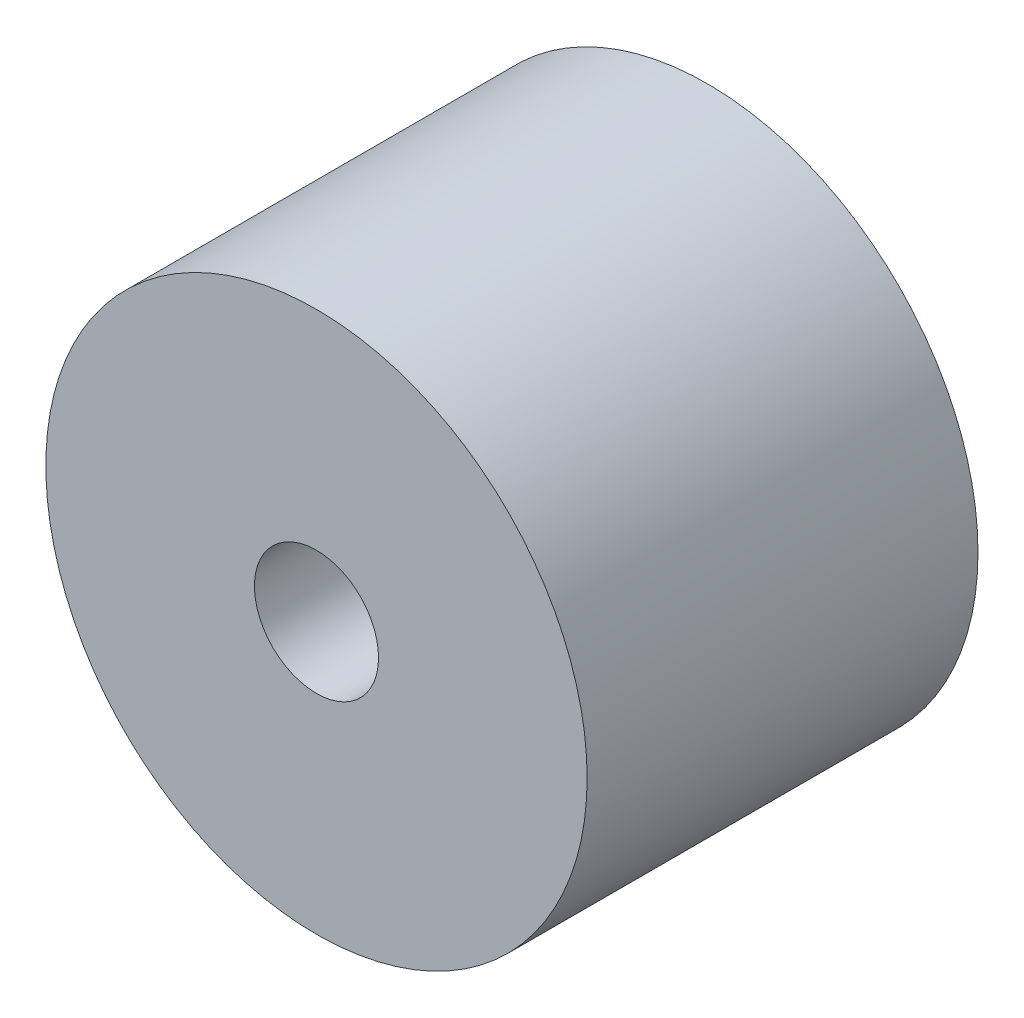
ISO-10303-21;
HEADER;
FILE_DESCRIPTION(('STEP AP214'),'2;1');
FILE_NAME('part.step','',(''),(''),'','','');
FILE_SCHEMA(('AUTOMOTIVE_DESIGN { 1 0 10303 214 1 1 1 1 }'));
ENDSEC;
DATA;
#1=APPLICATION_CONTEXT('core data for automotive mechanical design processes');
#2=APPLICATION_PROTOCOL_DEFINITION('international standard','automotive_design',2000,#1);
#3=PRODUCT_CONTEXT('',#1,'mechanical');
#4=PRODUCT('Part','Part','',(#3));
#5=PRODUCT_RELATED_PRODUCT_CATEGORY('part','',(#4));
#6=PRODUCT_DEFINITION_FORMATION('','',#4);
#7=PRODUCT_DEFINITION_CONTEXT('part definition',#1,'design');
#8=PRODUCT_DEFINITION('design','',#6,#7);
#9=PRODUCT_DEFINITION_SHAPE('','',#8);
#10=(LENGTH_UNIT() NAMED_UNIT(*) SI_UNIT(.MILLI.,.METRE.));
#11=(NAMED_UNIT(*) PLANE_ANGLE_UNIT() SI_UNIT($,.RADIAN.));
#12=(NAMED_UNIT(*) SI_UNIT($,.STERADIAN.) SOLID_ANGLE_UNIT());
#13=UNCERTAINTY_MEASURE_WITH_UNIT(LENGTH_MEASURE(1.E-05),#10,'distance_accuracy_value','');
#14=(GEOMETRIC_REPRESENTATION_CONTEXT(3) GLOBAL_UNCERTAINTY_ASSIGNED_CONTEXT((#13)) GLOBAL_UNIT_ASSIGNED_CONTEXT((#10,
#11,#12)) REPRESENTATION_CONTEXT('',''));
#15=CARTESIAN_POINT('',(0.,0.,0.));
#16=DIRECTION('',(0.,0.,1.));
#17=DIRECTION('',(1.,0.,0.));
#18=AXIS2_PLACEMENT_3D('',#15,#16,#17);
#19=CARTESIAN_POINT('',(0.,0.,40.));
#20=DIRECTION('',(0.,0.,-1.));
#21=DIRECTION('',(-1.,0.,0.));
#22=AXIS2_PLACEMENT_3D('',#19,#20,#21);
#23=CYLINDRICAL_SURFACE('',#22,27.7);
#24=CARTESIAN_POINT('',(0.,0.,40.));
#25=DIRECTION('',(0.,0.,1.));
#26=DIRECTION('',(1.,0.,0.));
#27=AXIS2_PLACEMENT_3D('',#24,#25,#26);
#28=CIRCLE('',#27,27.7);
#29=CARTESIAN_POINT('',(27.7,0.,40.));
#30=VERTEX_POINT('',#29);
#31=EDGE_CURVE('E10',#30,#30,#28,.T.);
#32=ORIENTED_EDGE('',*,*,#31,.F.);
#33=EDGE_LOOP('',(#32));
#34=FACE_BOUND('',#33,.T.);
#35=CARTESIAN_POINT('',(0.,0.,0.));
#36=DIRECTION('',(0.,0.,1.));
#37=DIRECTION('',(1.,0.,0.));
#38=AXIS2_PLACEMENT_3D('',#35,#36,#37);
#39=CIRCLE('',#38,27.7);
#40=CARTESIAN_POINT('',(27.7,0.,0.));
#41=VERTEX_POINT('',#40);
#42=EDGE_CURVE('E46',#41,#41,#39,.T.);
#43=ORIENTED_EDGE('',*,*,#42,.T.);
#44=EDGE_LOOP('',(#43));
#45=FACE_BOUND('',#44,.T.);
#46=ADVANCED_FACE('F43',(#34,#45),#23,.T.);
#47=CARTESIAN_POINT('',(0.,0.,40.));
#48=DIRECTION('',(0.,0.,1.));
#49=DIRECTION('',(1.,0.,0.));
#50=AXIS2_PLACEMENT_3D('',#47,#48,#49);
#51=PLANE('',#50);
#52=CARTESIAN_POINT('',(0.,0.,40.));
#53=DIRECTION('',(0.,0.,1.));
#54=DIRECTION('',(1.,0.,0.));
#55=AXIS2_PLACEMENT_3D('',#52,#53,#54);
#56=CIRCLE('',#55,6.35);
#57=CARTESIAN_POINT('',(6.35,0.,40.));
#58=VERTEX_POINT('',#57);
#59=EDGE_CURVE('E57',#58,#58,#56,.T.);
#60=ORIENTED_EDGE('',*,*,#59,.F.);
#61=EDGE_LOOP('',(#60));
#62=FACE_BOUND('',#61,.T.);
#63=ORIENTED_EDGE('',*,*,#31,.T.);
#64=EDGE_LOOP('',(#63));
#65=FACE_BOUND('',#64,.T.);
#66=ADVANCED_FACE('F74',(#62,#65),#51,.T.);
#67=CARTESIAN_POINT('',(0.,0.,0.));
#68=DIRECTION('',(0.,0.,1.));
#69=DIRECTION('',(1.,0.,0.));
#70=AXIS2_PLACEMENT_3D('',#67,#68,#69);
#71=PLANE('',#70);
#72=CARTESIAN_POINT('',(0.,0.,0.));
#73=DIRECTION('',(0.,0.,1.));
#74=DIRECTION('',(1.,0.,0.));
#75=AXIS2_PLACEMENT_3D('',#72,#73,#74);
#76=CIRCLE('',#75,6.35);
#77=CARTESIAN_POINT('',(6.35,0.,0.));
#78=VERTEX_POINT('',#77);
#79=EDGE_CURVE('E55',#78,#78,#76,.T.);
#80=ORIENTED_EDGE('',*,*,#79,.T.);
#81=EDGE_LOOP('',(#80));
#82=FACE_BOUND('',#81,.T.);
#83=ORIENTED_EDGE('',*,*,#42,.F.);
#84=EDGE_LOOP('',(#83));
#85=FACE_BOUND('',#84,.T.);
#86=ADVANCED_FACE('F65',(#82,#85),#71,.F.);
#87=CARTESIAN_POINT('',(0.,0.,0.));
#88=DIRECTION('',(0.,0.,1.));
#89=DIRECTION('',(1.,0.,0.));
#90=AXIS2_PLACEMENT_3D('',#87,#88,#89);
#91=CYLINDRICAL_SURFACE('',#90,6.35);
#92=ORIENTED_EDGE('',*,*,#79,.F.);
#93=EDGE_LOOP('',(#92));
#94=FACE_BOUND('',#93,.T.);
#95=ORIENTED_EDGE('',*,*,#59,.T.);
#96=EDGE_LOOP('',(#95));
#97=FACE_BOUND('',#96,.T.);
#98=ADVANCED_FACE('F68',(#94,#97),#91,.F.);
#99=CLOSED_SHELL('',(#46,#66,#86,#98));
#100=MANIFOLD_SOLID_BREP('B2',#99);
#101=ADVANCED_BREP_SHAPE_REPRESENTATION('',(#18,#100),#14);
#102=SHAPE_DEFINITION_REPRESENTATION(#9,#101);
ENDSEC;
END-ISO-10303-21;
